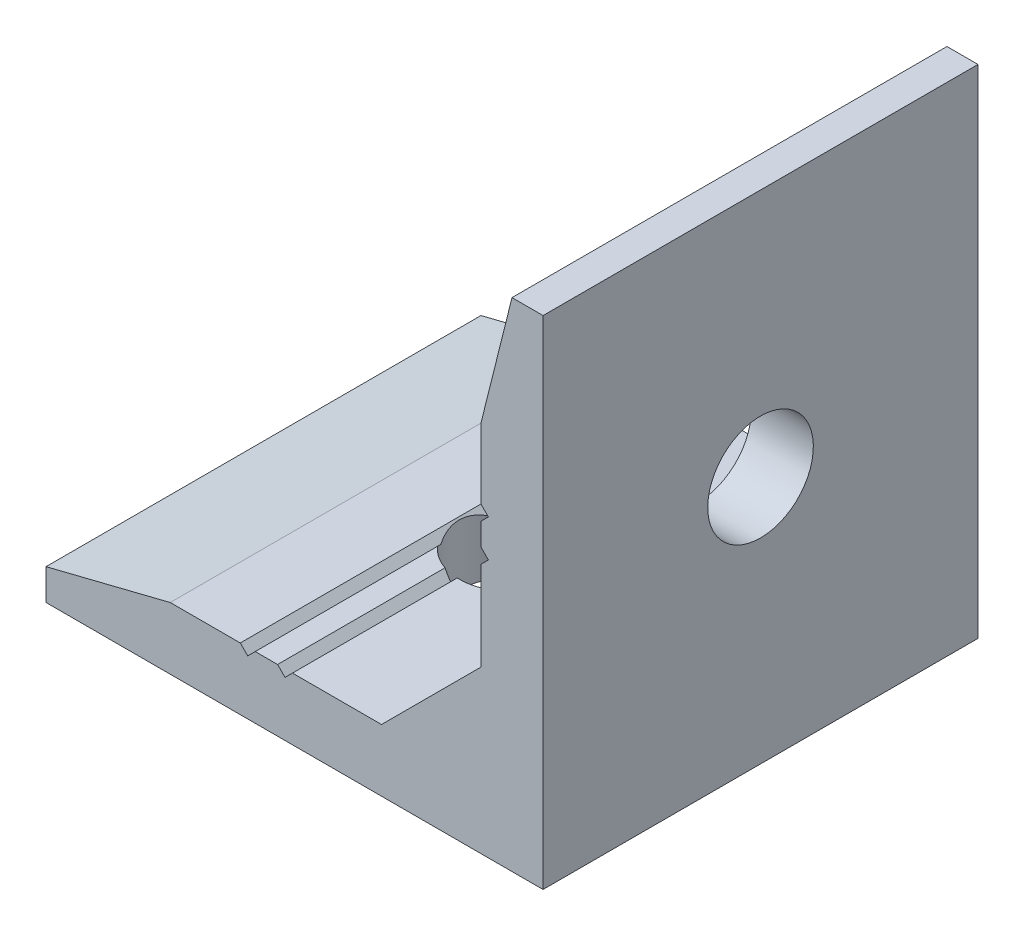
ISO-10303-21;
HEADER;
FILE_DESCRIPTION(('STEP AP214'),'2;1');
FILE_NAME('part.step','',(''),(''),'','','');
FILE_SCHEMA(('AUTOMOTIVE_DESIGN { 1 0 10303 214 1 1 1 1 }'));
ENDSEC;
DATA;
#1=APPLICATION_CONTEXT('core data for automotive mechanical design processes');
#2=APPLICATION_PROTOCOL_DEFINITION('international standard','automotive_design',2000,#1);
#3=PRODUCT_CONTEXT('',#1,'mechanical');
#4=PRODUCT('Part','Part','',(#3));
#5=PRODUCT_RELATED_PRODUCT_CATEGORY('part','',(#4));
#6=PRODUCT_DEFINITION_FORMATION('','',#4);
#7=PRODUCT_DEFINITION_CONTEXT('part definition',#1,'design');
#8=PRODUCT_DEFINITION('design','',#6,#7);
#9=PRODUCT_DEFINITION_SHAPE('','',#8);
#10=(LENGTH_UNIT() NAMED_UNIT(*) SI_UNIT(.MILLI.,.METRE.));
#11=(NAMED_UNIT(*) PLANE_ANGLE_UNIT() SI_UNIT($,.RADIAN.));
#12=(NAMED_UNIT(*) SI_UNIT($,.STERADIAN.) SOLID_ANGLE_UNIT());
#13=UNCERTAINTY_MEASURE_WITH_UNIT(LENGTH_MEASURE(1.E-05),#10,'distance_accuracy_value','');
#14=(GEOMETRIC_REPRESENTATION_CONTEXT(3) GLOBAL_UNCERTAINTY_ASSIGNED_CONTEXT((#13)) GLOBAL_UNIT_ASSIGNED_CONTEXT((#10,
#11,#12)) REPRESENTATION_CONTEXT('',''));
#15=CARTESIAN_POINT('',(0.,0.,0.));
#16=DIRECTION('',(0.,0.,1.));
#17=DIRECTION('',(1.,0.,0.));
#18=AXIS2_PLACEMENT_3D('',#15,#16,#17);
#19=CARTESIAN_POINT('',(35.599999999999,23.7649508334723,17.5));
#20=DIRECTION('',(0.707106781186548,-0.707106781186548,0.));
#21=DIRECTION('',(0.707106781186548,0.707106781186548,0.));
#22=AXIS2_PLACEMENT_3D('',#19,#20,#21);
#23=PLANE('',#22);
#24=DIRECTION('',(0.,0.,-1.));
#25=VECTOR('',#24,1.);
#26=CARTESIAN_POINT('',(35.,23.1649508334733,17.5));
#27=LINE('',#26,#25);
#28=CARTESIAN_POINT('',(35.0000000000001,23.1649508334733,-2.83647425895197));
#29=VERTEX_POINT('',#28);
#30=CARTESIAN_POINT('',(35.,23.1649508334733,-17.5));
#31=VERTEX_POINT('',#30);
#32=EDGE_CURVE('E268',#29,#31,#27,.T.);
#33=ORIENTED_EDGE('',*,*,#32,.F.);
#34=CARTESIAN_POINT('',(31.8350491665269,20.0000000000002,0.));
#35=DIRECTION('',(0.707106781186548,-0.707106781186548,0.));
#36=DIRECTION('',(-0.707106781186548,-0.707106781186548,0.));
#37=AXIS2_PLACEMENT_3D('',#34,#35,#36);
#38=ELLIPSE('',#37,6.01040764008546,4.25);
#39=CARTESIAN_POINT('',(35.599999999999,23.7649508334723,-1.97171124192581));
#40=VERTEX_POINT('',#39);
#41=EDGE_CURVE('E546',#29,#40,#38,.T.);
#42=ORIENTED_EDGE('',*,*,#41,.T.);
#43=DIRECTION('',(0.,0.,-1.));
#44=VECTOR('',#43,1.);
#45=CARTESIAN_POINT('',(35.599999999999,23.7649508334723,17.5));
#46=LINE('',#45,#44);
#47=CARTESIAN_POINT('',(35.599999999999,23.7649508334723,-17.5));
#48=VERTEX_POINT('',#47);
#49=EDGE_CURVE('E272',#40,#48,#46,.T.);
#50=ORIENTED_EDGE('',*,*,#49,.T.);
#51=DIRECTION('',(-0.707106781186548,-0.707106781186548,0.));
#52=VECTOR('',#51,1.);
#53=CARTESIAN_POINT('',(35.599999999999,23.7649508334723,-17.5));
#54=LINE('',#53,#52);
#55=EDGE_CURVE('E416',#48,#31,#54,.T.);
#56=ORIENTED_EDGE('',*,*,#55,.T.);
#57=EDGE_LOOP('',(#33,#42,#50,#56));
#58=FACE_BOUND('',#57,.T.);
#59=ADVANCED_FACE('F35',(#58),#23,.F.);
#60=CARTESIAN_POINT('',(34.9999999999998,21.3649508334714,17.5));
#61=DIRECTION('',(1.,-1.27213054904832E-13,0.));
#62=DIRECTION('',(1.27213054904832E-13,1.,0.));
#63=AXIS2_PLACEMENT_3D('',#60,#61,#62);
#64=PLANE('',#63);
#65=CARTESIAN_POINT('',(35.,23.1649508334733,17.5));
#66=VERTEX_POINT('',#65);
#67=CARTESIAN_POINT('',(35.0000000000001,23.1649508334733,2.83647425895197));
#68=VERTEX_POINT('',#67);
#69=EDGE_CURVE('E269',#66,#68,#27,.T.);
#70=ORIENTED_EDGE('',*,*,#69,.T.);
#71=CARTESIAN_POINT('',(35.,20.0000000000001,0.));
#72=DIRECTION('',(-1.,0.,0.));
#73=DIRECTION('',(0.,-1.,0.));
#74=AXIS2_PLACEMENT_3D('',#71,#72,#73);
#75=CIRCLE('',#74,4.25);
#76=CARTESIAN_POINT('',(35.0000000000001,21.3649508334712,4.0248489688691));
#77=VERTEX_POINT('',#76);
#78=EDGE_CURVE('E629',#77,#68,#75,.T.);
#79=ORIENTED_EDGE('',*,*,#78,.F.);
#80=DIRECTION('',(0.,0.,-1.));
#81=VECTOR('',#80,1.);
#82=CARTESIAN_POINT('',(34.9999999999998,21.3649508334714,17.5));
#83=LINE('',#82,#81);
#84=CARTESIAN_POINT('',(34.9999999999998,21.3649508334714,17.5));
#85=VERTEX_POINT('',#84);
#86=EDGE_CURVE('E265',#85,#77,#83,.T.);
#87=ORIENTED_EDGE('',*,*,#86,.F.);
#88=DIRECTION('',(-1.27213054904832E-13,-1.,0.));
#89=VECTOR('',#88,1.);
#90=CARTESIAN_POINT('',(34.9999999999998,21.3649508334714,17.5));
#91=LINE('',#90,#89);
#92=EDGE_CURVE('E492',#66,#85,#91,.T.);
#93=ORIENTED_EDGE('',*,*,#92,.F.);
#94=EDGE_LOOP('',(#70,#79,#87,#93));
#95=FACE_BOUND('',#94,.T.);
#96=ADVANCED_FACE('F525',(#95),#64,.F.);
#97=CARTESIAN_POINT('',(35.5999999999993,20.7649508334723,17.5));
#98=DIRECTION('',(0.707106781186345,0.70710678118675,0.));
#99=DIRECTION('',(-0.70710678118675,0.707106781186345,0.));
#100=AXIS2_PLACEMENT_3D('',#97,#98,#99);
#101=PLANE('',#100);
#102=ORIENTED_EDGE('',*,*,#86,.T.);
#103=CARTESIAN_POINT('',(36.364950833472,20.,0.));
#104=DIRECTION('',(0.707106781186345,0.70710678118675,0.));
#105=DIRECTION('',(-0.70710678118675,0.707106781186345,0.));
#106=AXIS2_PLACEMENT_3D('',#103,#104,#105);
#107=ELLIPSE('',#106,6.01040764008757,4.25);
#108=CARTESIAN_POINT('',(35.5999999999993,20.7649508334723,4.18059208992819));
#109=VERTEX_POINT('',#108);
#110=EDGE_CURVE('E250',#77,#109,#107,.T.);
#111=ORIENTED_EDGE('',*,*,#110,.T.);
#112=DIRECTION('',(0.,0.,-1.));
#113=VECTOR('',#112,1.);
#114=CARTESIAN_POINT('',(35.5999999999993,20.7649508334723,17.5));
#115=LINE('',#114,#113);
#116=CARTESIAN_POINT('',(35.5999999999993,20.7649508334723,17.5));
#117=VERTEX_POINT('',#116);
#118=EDGE_CURVE('E249',#117,#109,#115,.T.);
#119=ORIENTED_EDGE('',*,*,#118,.F.);
#120=DIRECTION('',(0.70710678118675,-0.707106781186345,0.));
#121=VECTOR('',#120,1.);
#122=CARTESIAN_POINT('',(35.5999999999993,20.7649508334723,17.5));
#123=LINE('',#122,#121);
#124=EDGE_CURVE('E494',#85,#117,#123,.T.);
#125=ORIENTED_EDGE('',*,*,#124,.F.);
#126=EDGE_LOOP('',(#102,#111,#119,#125));
#127=FACE_BOUND('',#126,.T.);
#128=ADVANCED_FACE('F531',(#127),#101,.F.);
#129=CARTESIAN_POINT('',(35.5999999999993,20.7649508334723,17.5));
#130=DIRECTION('',(0.707106781186615,-0.70710678118648,0.));
#131=DIRECTION('',(0.70710678118648,0.707106781186615,0.));
#132=AXIS2_PLACEMENT_3D('',#129,#130,#131);
#133=PLANE('',#132);
#134=DIRECTION('',(0.,0.,-1.));
#135=VECTOR('',#134,1.);
#136=CARTESIAN_POINT('',(35.,20.164950833473,17.5));
#137=LINE('',#136,#135);
#138=CARTESIAN_POINT('',(35.,20.164950833473,-4.24679776096491));
#139=VERTEX_POINT('',#138);
#140=CARTESIAN_POINT('',(35.,20.164950833473,-17.5));
#141=VERTEX_POINT('',#140);
#142=EDGE_CURVE('E257',#139,#141,#137,.T.);
#143=ORIENTED_EDGE('',*,*,#142,.F.);
#144=CARTESIAN_POINT('',(34.8350491665272,20.0000000000001,0.));
#145=DIRECTION('',(0.707106781186615,-0.70710678118648,0.));
#146=DIRECTION('',(-0.70710678118648,-0.707106781186615,0.));
#147=AXIS2_PLACEMENT_3D('',#144,#145,#146);
#148=ELLIPSE('',#147,6.01040764008489,4.25);
#149=CARTESIAN_POINT('',(35.5999999999993,20.7649508334723,-4.18059208992818));
#150=VERTEX_POINT('',#149);
#151=EDGE_CURVE('E50',#139,#150,#148,.T.);
#152=ORIENTED_EDGE('',*,*,#151,.T.);
#153=CARTESIAN_POINT('',(35.5999999999993,20.7649508334723,-17.5));
#154=VERTEX_POINT('',#153);
#155=EDGE_CURVE('E256',#150,#154,#115,.T.);
#156=ORIENTED_EDGE('',*,*,#155,.T.);
#157=DIRECTION('',(-0.70710678118648,-0.707106781186615,0.));
#158=VECTOR('',#157,1.);
#159=CARTESIAN_POINT('',(35.5999999999993,20.7649508334723,-17.5));
#160=LINE('',#159,#158);
#161=EDGE_CURVE('E356',#154,#141,#160,.T.);
#162=ORIENTED_EDGE('',*,*,#161,.T.);
#163=EDGE_LOOP('',(#143,#152,#156,#162));
#164=FACE_BOUND('',#163,.T.);
#165=ADVANCED_FACE('F426',(#164),#133,.F.);
#166=CARTESIAN_POINT('',(19.2350491665275,4.39999999999998,17.5));
#167=DIRECTION('',(0.707106781186479,-0.707106781186616,0.));
#168=DIRECTION('',(0.707106781186616,0.707106781186479,0.));
#169=AXIS2_PLACEMENT_3D('',#166,#167,#168);
#170=PLANE('',#169);
#171=DIRECTION('',(0.,0.,-1.));
#172=VECTOR('',#171,1.);
#173=CARTESIAN_POINT('',(19.8350491665276,5.,17.5));
#174=LINE('',#173,#172);
#175=CARTESIAN_POINT('',(19.8350491665276,5.,17.5));
#176=VERTEX_POINT('',#175);
#177=CARTESIAN_POINT('',(19.8350491665276,5.,4.24679776096493));
#178=VERTEX_POINT('',#177);
#179=EDGE_CURVE('E329',#176,#178,#174,.T.);
#180=ORIENTED_EDGE('',*,*,#179,.T.);
#181=CARTESIAN_POINT('',(20.,5.16495083347237,0.));
#182=DIRECTION('',(0.707106781186479,-0.707106781186616,0.));
#183=DIRECTION('',(0.707106781186616,0.707106781186479,0.));
#184=AXIS2_PLACEMENT_3D('',#181,#182,#183);
#185=ELLIPSE('',#184,6.01040764008507,4.25);
#186=CARTESIAN_POINT('',(19.2350491665275,4.39999999999998,4.18059208992814));
#187=VERTEX_POINT('',#186);
#188=EDGE_CURVE('E402',#178,#187,#185,.T.);
#189=ORIENTED_EDGE('',*,*,#188,.T.);
#190=DIRECTION('',(0.,0.,-1.));
#191=VECTOR('',#190,1.);
#192=CARTESIAN_POINT('',(19.2350491665275,4.39999999999998,17.5));
#193=LINE('',#192,#191);
#194=CARTESIAN_POINT('',(19.2350491665275,4.39999999999998,17.5));
#195=VERTEX_POINT('',#194);
#196=EDGE_CURVE('E325',#195,#187,#193,.T.);
#197=ORIENTED_EDGE('',*,*,#196,.F.);
#198=DIRECTION('',(-0.707106781186616,-0.707106781186479,0.));
#199=VECTOR('',#198,1.);
#200=CARTESIAN_POINT('',(19.2350491665275,4.39999999999998,17.5));
#201=LINE('',#200,#199);
#202=EDGE_CURVE('E502',#176,#195,#201,.T.);
#203=ORIENTED_EDGE('',*,*,#202,.F.);
#204=EDGE_LOOP('',(#180,#189,#197,#203));
#205=FACE_BOUND('',#204,.T.);
#206=ADVANCED_FACE('F599',(#205),#170,.F.);
#207=CARTESIAN_POINT('',(19.2350491665275,4.39999999999998,17.5));
#208=DIRECTION('',(-0.707106781186481,-0.707106781186614,0.));
#209=DIRECTION('',(0.707106781186614,-0.707106781186481,0.));
#210=AXIS2_PLACEMENT_3D('',#207,#208,#209);
#211=PLANE('',#210);
#212=DIRECTION('',(0.,0.,-1.));
#213=VECTOR('',#212,1.);
#214=CARTESIAN_POINT('',(18.6350491665274,5.,17.5));
#215=LINE('',#214,#213);
#216=CARTESIAN_POINT('',(18.6350491665274,5.,-4.02484896886855));
#217=VERTEX_POINT('',#216);
#218=CARTESIAN_POINT('',(18.6350491665274,5.,-17.5));
#219=VERTEX_POINT('',#218);
#220=EDGE_CURVE('E320',#217,#219,#215,.T.);
#221=ORIENTED_EDGE('',*,*,#220,.F.);
#222=CARTESIAN_POINT('',(20.,3.63504916652758,0.));
#223=DIRECTION('',(-0.707106781186481,-0.707106781186614,0.));
#224=DIRECTION('',(-0.707106781186614,0.707106781186481,0.));
#225=AXIS2_PLACEMENT_3D('',#222,#223,#224);
#226=ELLIPSE('',#225,6.01040764008509,4.25);
#227=CARTESIAN_POINT('',(19.2350491665275,4.39999999999998,-4.18059208992814));
#228=VERTEX_POINT('',#227);
#229=EDGE_CURVE('E400',#217,#228,#226,.T.);
#230=ORIENTED_EDGE('',*,*,#229,.T.);
#231=CARTESIAN_POINT('',(19.2350491665275,4.39999999999998,-17.5));
#232=VERTEX_POINT('',#231);
#233=EDGE_CURVE('E324',#228,#232,#193,.T.);
#234=ORIENTED_EDGE('',*,*,#233,.T.);
#235=DIRECTION('',(-0.707106781186614,0.707106781186481,0.));
#236=VECTOR('',#235,1.);
#237=CARTESIAN_POINT('',(19.2350491665275,4.39999999999998,-17.5));
#238=LINE('',#237,#236);
#239=EDGE_CURVE('E362',#232,#219,#238,.T.);
#240=ORIENTED_EDGE('',*,*,#239,.T.);
#241=EDGE_LOOP('',(#221,#230,#234,#240));
#242=FACE_BOUND('',#241,.T.);
#243=ADVANCED_FACE('F568',(#242),#211,.F.);
#244=CARTESIAN_POINT('',(16.8350491665274,5.,17.5));
#245=DIRECTION('',(0.,-1.,0.));
#246=DIRECTION('',(0.,0.,-1.));
#247=AXIS2_PLACEMENT_3D('',#244,#245,#246);
#248=PLANE('',#247);
#249=CARTESIAN_POINT('',(18.6350491665274,5.,17.5));
#250=VERTEX_POINT('',#249);
#251=CARTESIAN_POINT('',(18.6350491665274,5.,4.02484896886855));
#252=VERTEX_POINT('',#251);
#253=EDGE_CURVE('E321',#250,#252,#215,.T.);
#254=ORIENTED_EDGE('',*,*,#253,.T.);
#255=CARTESIAN_POINT('',(20.,5.,0.));
#256=DIRECTION('',(0.,1.,0.));
#257=DIRECTION('',(0.,0.,1.));
#258=AXIS2_PLACEMENT_3D('',#255,#256,#257);
#259=CIRCLE('',#258,4.25);
#260=CARTESIAN_POINT('',(16.8350491665274,5.,2.83647425895264));
#261=VERTEX_POINT('',#260);
#262=EDGE_CURVE('E557',#261,#252,#259,.T.);
#263=ORIENTED_EDGE('',*,*,#262,.F.);
#264=DIRECTION('',(0.,0.,-1.));
#265=VECTOR('',#264,1.);
#266=CARTESIAN_POINT('',(16.8350491665274,5.,17.5));
#267=LINE('',#266,#265);
#268=CARTESIAN_POINT('',(16.8350491665274,5.,17.5));
#269=VERTEX_POINT('',#268);
#270=EDGE_CURVE('E317',#269,#261,#267,.T.);
#271=ORIENTED_EDGE('',*,*,#270,.F.);
#272=DIRECTION('',(-1.,0.,0.));
#273=VECTOR('',#272,1.);
#274=CARTESIAN_POINT('',(16.8350491665274,5.,17.5));
#275=LINE('',#274,#273);
#276=EDGE_CURVE('E506',#250,#269,#275,.T.);
#277=ORIENTED_EDGE('',*,*,#276,.F.);
#278=EDGE_LOOP('',(#254,#263,#271,#277));
#279=FACE_BOUND('',#278,.T.);
#280=ADVANCED_FACE('F580',(#279),#248,.F.);
#281=CARTESIAN_POINT('',(16.2350491665275,4.39999999999998,17.5));
#282=DIRECTION('',(0.707106781186614,-0.707106781186481,0.));
#283=DIRECTION('',(0.707106781186481,0.707106781186614,0.));
#284=AXIS2_PLACEMENT_3D('',#281,#282,#283);
#285=PLANE('',#284);
#286=ORIENTED_EDGE('',*,*,#270,.T.);
#287=CARTESIAN_POINT('',(20.,8.16495083347323,0.));
#288=DIRECTION('',(0.707106781186614,-0.707106781186481,0.));
#289=DIRECTION('',(0.707106781186481,0.707106781186614,0.));
#290=AXIS2_PLACEMENT_3D('',#287,#288,#289);
#291=ELLIPSE('',#290,6.01040764008622,4.25);
#292=CARTESIAN_POINT('',(16.2350491665275,4.39999999999998,1.97171124192526));
#293=VERTEX_POINT('',#292);
#294=EDGE_CURVE('E558',#261,#293,#291,.T.);
#295=ORIENTED_EDGE('',*,*,#294,.T.);
#296=DIRECTION('',(0.,0.,-1.));
#297=VECTOR('',#296,1.);
#298=CARTESIAN_POINT('',(16.2350491665275,4.39999999999998,17.5));
#299=LINE('',#298,#297);
#300=CARTESIAN_POINT('',(16.2350491665275,4.39999999999998,17.5));
#301=VERTEX_POINT('',#300);
#302=EDGE_CURVE('E301',#301,#293,#299,.T.);
#303=ORIENTED_EDGE('',*,*,#302,.F.);
#304=DIRECTION('',(-0.707106781186481,-0.707106781186614,0.));
#305=VECTOR('',#304,1.);
#306=CARTESIAN_POINT('',(16.2350491665275,4.39999999999998,17.5));
#307=LINE('',#306,#305);
#308=EDGE_CURVE('E508',#269,#301,#307,.T.);
#309=ORIENTED_EDGE('',*,*,#308,.F.);
#310=EDGE_LOOP('',(#286,#295,#303,#309));
#311=FACE_BOUND('',#310,.T.);
#312=ADVANCED_FACE('F584',(#311),#285,.F.);
#313=CARTESIAN_POINT('',(0.,2.5,17.5));
#314=DIRECTION('',(1.,0.,0.));
#315=DIRECTION('',(0.,0.,-1.));
#316=AXIS2_PLACEMENT_3D('',#313,#314,#315);
#317=PLANE('',#316);
#318=DIRECTION('',(0.,-1.,0.));
#319=VECTOR('',#318,1.);
#320=CARTESIAN_POINT('',(0.,2.5,-17.5));
#321=LINE('',#320,#319);
#322=CARTESIAN_POINT('',(0.,2.5,-17.5));
#323=VERTEX_POINT('',#322);
#324=CARTESIAN_POINT('',(0.,0.,-17.5));
#325=VERTEX_POINT('',#324);
#326=EDGE_CURVE('E390',#323,#325,#321,.T.);
#327=ORIENTED_EDGE('',*,*,#326,.T.);
#328=DIRECTION('',(0.,0.,-1.));
#329=VECTOR('',#328,1.);
#330=CARTESIAN_POINT('',(0.,0.,17.5));
#331=LINE('',#330,#329);
#332=CARTESIAN_POINT('',(0.,0.,17.5));
#333=VERTEX_POINT('',#332);
#334=EDGE_CURVE('E291',#333,#325,#331,.T.);
#335=ORIENTED_EDGE('',*,*,#334,.F.);
#336=DIRECTION('',(0.,-1.,0.));
#337=VECTOR('',#336,1.);
#338=CARTESIAN_POINT('',(0.,2.5,17.5));
#339=LINE('',#338,#337);
#340=CARTESIAN_POINT('',(0.,2.5,17.5));
#341=VERTEX_POINT('',#340);
#342=EDGE_CURVE('E375',#341,#333,#339,.T.);
#343=ORIENTED_EDGE('',*,*,#342,.F.);
#344=DIRECTION('',(0.,0.,-1.));
#345=VECTOR('',#344,1.);
#346=CARTESIAN_POINT('',(0.,2.5,17.5));
#347=LINE('',#346,#345);
#348=EDGE_CURVE('E376',#341,#323,#347,.T.);
#349=ORIENTED_EDGE('',*,*,#348,.T.);
#350=EDGE_LOOP('',(#327,#335,#343,#349));
#351=FACE_BOUND('',#350,.T.);
#352=ADVANCED_FACE('F37',(#351),#317,.F.);
#353=CARTESIAN_POINT('',(0.,0.,17.5));
#354=DIRECTION('',(0.,1.,0.));
#355=DIRECTION('',(0.,0.,1.));
#356=AXIS2_PLACEMENT_3D('',#353,#354,#355);
#357=PLANE('',#356);
#358=CARTESIAN_POINT('',(20.,0.,0.));
#359=DIRECTION('',(0.,1.,0.));
#360=DIRECTION('',(0.,0.,1.));
#361=AXIS2_PLACEMENT_3D('',#358,#359,#360);
#362=CIRCLE('',#361,4.25);
#363=CARTESIAN_POINT('',(20.,0.,4.25));
#364=VERTEX_POINT('',#363);
#365=EDGE_CURVE('E552',#364,#364,#362,.T.);
#366=ORIENTED_EDGE('',*,*,#365,.T.);
#367=EDGE_LOOP('',(#366));
#368=FACE_BOUND('',#367,.T.);
#369=DIRECTION('',(1.,0.,0.));
#370=VECTOR('',#369,1.);
#371=CARTESIAN_POINT('',(0.,0.,-17.5));
#372=LINE('',#371,#370);
#373=CARTESIAN_POINT('',(40.,0.,-17.5));
#374=VERTEX_POINT('',#373);
#375=EDGE_CURVE('E392',#325,#374,#372,.T.);
#376=ORIENTED_EDGE('',*,*,#375,.T.);
#377=DIRECTION('',(0.,0.,-1.));
#378=VECTOR('',#377,1.);
#379=CARTESIAN_POINT('',(40.,0.,17.5));
#380=LINE('',#379,#378);
#381=CARTESIAN_POINT('',(40.,0.,17.5));
#382=VERTEX_POINT('',#381);
#383=EDGE_CURVE('E288',#382,#374,#380,.T.);
#384=ORIENTED_EDGE('',*,*,#383,.F.);
#385=DIRECTION('',(1.,0.,0.));
#386=VECTOR('',#385,1.);
#387=CARTESIAN_POINT('',(0.,0.,17.5));
#388=LINE('',#387,#386);
#389=EDGE_CURVE('E477',#333,#382,#388,.T.);
#390=ORIENTED_EDGE('',*,*,#389,.F.);
#391=ORIENTED_EDGE('',*,*,#334,.T.);
#392=EDGE_LOOP('',(#376,#384,#390,#391));
#393=FACE_BOUND('',#392,.T.);
#394=ADVANCED_FACE('F476',(#368,#393),#357,.F.);
#395=CARTESIAN_POINT('',(40.,0.,17.5));
#396=DIRECTION('',(-1.,0.,0.));
#397=DIRECTION('',(0.,0.,1.));
#398=AXIS2_PLACEMENT_3D('',#395,#396,#397);
#399=PLANE('',#398);
#400=CARTESIAN_POINT('',(40.0000000000007,19.9999999999999,0.));
#401=DIRECTION('',(-1.,0.,0.));
#402=DIRECTION('',(0.,-1.,0.));
#403=AXIS2_PLACEMENT_3D('',#400,#401,#402);
#404=CIRCLE('',#403,4.25);
#405=CARTESIAN_POINT('',(40.0000000000005,15.7499999999999,0.));
#406=VERTEX_POINT('',#405);
#407=EDGE_CURVE('E251',#406,#406,#404,.T.);
#408=ORIENTED_EDGE('',*,*,#407,.T.);
#409=EDGE_LOOP('',(#408));
#410=FACE_BOUND('',#409,.T.);
#411=DIRECTION('',(0.,1.,0.));
#412=VECTOR('',#411,1.);
#413=CARTESIAN_POINT('',(40.,0.,-17.5));
#414=LINE('',#413,#412);
#415=CARTESIAN_POINT('',(40.,40.,-17.5));
#416=VERTEX_POINT('',#415);
#417=EDGE_CURVE('E397',#374,#416,#414,.T.);
#418=ORIENTED_EDGE('',*,*,#417,.T.);
#419=DIRECTION('',(0.,0.,-1.));
#420=VECTOR('',#419,1.);
#421=CARTESIAN_POINT('',(40.,40.,17.5));
#422=LINE('',#421,#420);
#423=CARTESIAN_POINT('',(40.,40.,17.5));
#424=VERTEX_POINT('',#423);
#425=EDGE_CURVE('E285',#424,#416,#422,.T.);
#426=ORIENTED_EDGE('',*,*,#425,.F.);
#427=DIRECTION('',(0.,1.,0.));
#428=VECTOR('',#427,1.);
#429=CARTESIAN_POINT('',(40.,0.,17.5));
#430=LINE('',#429,#428);
#431=EDGE_CURVE('E473',#382,#424,#430,.T.);
#432=ORIENTED_EDGE('',*,*,#431,.F.);
#433=ORIENTED_EDGE('',*,*,#383,.T.);
#434=EDGE_LOOP('',(#418,#426,#432,#433));
#435=FACE_BOUND('',#434,.T.);
#436=ADVANCED_FACE('F472',(#410,#435),#399,.F.);
#437=CARTESIAN_POINT('',(37.5,40.,17.5));
#438=DIRECTION('',(0.,-1.,0.));
#439=DIRECTION('',(0.,0.,-1.));
#440=AXIS2_PLACEMENT_3D('',#437,#438,#439);
#441=PLANE('',#440);
#442=DIRECTION('',(-1.,0.,0.));
#443=VECTOR('',#442,1.);
#444=CARTESIAN_POINT('',(37.5,40.,-17.5));
#445=LINE('',#444,#443);
#446=CARTESIAN_POINT('',(37.5,40.,-17.5));
#447=VERTEX_POINT('',#446);
#448=EDGE_CURVE('E407',#416,#447,#445,.T.);
#449=ORIENTED_EDGE('',*,*,#448,.T.);
#450=DIRECTION('',(0.,0.,-1.));
#451=VECTOR('',#450,1.);
#452=CARTESIAN_POINT('',(37.5,40.,17.5));
#453=LINE('',#452,#451);
#454=CARTESIAN_POINT('',(37.5,40.,17.5));
#455=VERTEX_POINT('',#454);
#456=EDGE_CURVE('E282',#455,#447,#453,.T.);
#457=ORIENTED_EDGE('',*,*,#456,.F.);
#458=DIRECTION('',(-1.,0.,0.));
#459=VECTOR('',#458,1.);
#460=CARTESIAN_POINT('',(37.5,40.,17.5));
#461=LINE('',#460,#459);
#462=EDGE_CURVE('E469',#424,#455,#461,.T.);
#463=ORIENTED_EDGE('',*,*,#462,.F.);
#464=ORIENTED_EDGE('',*,*,#425,.T.);
#465=EDGE_LOOP('',(#449,#457,#463,#464));
#466=FACE_BOUND('',#465,.T.);
#467=ADVANCED_FACE('F466',(#466),#441,.F.);
#468=CARTESIAN_POINT('',(37.5,40.,17.5));
#469=DIRECTION('',(0.970142500145332,-0.242535625036332,0.));
#470=DIRECTION('',(0.242535625036332,0.970142500145332,0.));
#471=AXIS2_PLACEMENT_3D('',#468,#469,#470);
#472=PLANE('',#471);
#473=DIRECTION('',(-0.242535625036332,-0.970142500145332,0.));
#474=VECTOR('',#473,1.);
#475=CARTESIAN_POINT('',(37.5,40.,-17.5));
#476=LINE('',#475,#474);
#477=CARTESIAN_POINT('',(35.,30.,-17.5));
#478=VERTEX_POINT('',#477);
#479=EDGE_CURVE('E409',#447,#478,#476,.T.);
#480=ORIENTED_EDGE('',*,*,#479,.T.);
#481=DIRECTION('',(0.,0.,-1.));
#482=VECTOR('',#481,1.);
#483=CARTESIAN_POINT('',(35.,30.,17.5));
#484=LINE('',#483,#482);
#485=CARTESIAN_POINT('',(35.,30.,17.5));
#486=VERTEX_POINT('',#485);
#487=EDGE_CURVE('E279',#486,#478,#484,.T.);
#488=ORIENTED_EDGE('',*,*,#487,.F.);
#489=DIRECTION('',(-0.242535625036332,-0.970142500145332,0.));
#490=VECTOR('',#489,1.);
#491=CARTESIAN_POINT('',(37.5,40.,17.5));
#492=LINE('',#491,#490);
#493=EDGE_CURVE('E462',#455,#486,#492,.T.);
#494=ORIENTED_EDGE('',*,*,#493,.F.);
#495=ORIENTED_EDGE('',*,*,#456,.T.);
#496=EDGE_LOOP('',(#480,#488,#494,#495));
#497=FACE_BOUND('',#496,.T.);
#498=ADVANCED_FACE('F461',(#497),#472,.F.);
#499=CARTESIAN_POINT('',(35.,24.3649508334714,17.5));
#500=DIRECTION('',(1.,0.,0.));
#501=DIRECTION('',(0.,0.,-1.));
#502=AXIS2_PLACEMENT_3D('',#499,#500,#501);
#503=PLANE('',#502);
#504=DIRECTION('',(0.,-1.,0.));
#505=VECTOR('',#504,1.);
#506=CARTESIAN_POINT('',(35.,24.3649508334714,-17.5));
#507=LINE('',#506,#505);
#508=CARTESIAN_POINT('',(35.,24.3649508334714,-17.5));
#509=VERTEX_POINT('',#508);
#510=EDGE_CURVE('E411',#478,#509,#507,.T.);
#511=ORIENTED_EDGE('',*,*,#510,.T.);
#512=DIRECTION('',(0.,0.,-1.));
#513=VECTOR('',#512,1.);
#514=CARTESIAN_POINT('',(35.,24.3649508334714,17.5));
#515=LINE('',#514,#513);
#516=CARTESIAN_POINT('',(35.,24.3649508334714,17.5));
#517=VERTEX_POINT('',#516);
#518=EDGE_CURVE('E276',#517,#509,#515,.T.);
#519=ORIENTED_EDGE('',*,*,#518,.F.);
#520=DIRECTION('',(0.,-1.,0.));
#521=VECTOR('',#520,1.);
#522=CARTESIAN_POINT('',(35.,24.3649508334714,17.5));
#523=LINE('',#522,#521);
#524=EDGE_CURVE('E457',#486,#517,#523,.T.);
#525=ORIENTED_EDGE('',*,*,#524,.F.);
#526=ORIENTED_EDGE('',*,*,#487,.T.);
#527=EDGE_LOOP('',(#511,#519,#525,#526));
#528=FACE_BOUND('',#527,.T.);
#529=ADVANCED_FACE('F456',(#528),#503,.F.);
#530=CARTESIAN_POINT('',(35.599999999999,23.7649508334723,17.5));
#531=DIRECTION('',(0.707106781186617,0.707106781186478,0.));
#532=DIRECTION('',(-0.707106781186478,0.707106781186617,0.));
#533=AXIS2_PLACEMENT_3D('',#530,#531,#532);
#534=PLANE('',#533);
#535=ORIENTED_EDGE('',*,*,#49,.F.);
#536=CARTESIAN_POINT('',(39.3649508334707,19.9999999999999,0.));
#537=DIRECTION('',(0.707106781186617,0.707106781186478,0.));
#538=DIRECTION('',(-0.707106781186478,0.707106781186617,0.));
#539=AXIS2_PLACEMENT_3D('',#536,#537,#538);
#540=ELLIPSE('',#539,6.01040764008526,4.25);
#541=CARTESIAN_POINT('',(35.599999999999,23.7649508334723,1.97171124192582));
#542=VERTEX_POINT('',#541);
#543=EDGE_CURVE('E545',#40,#542,#540,.T.);
#544=ORIENTED_EDGE('',*,*,#543,.T.);
#545=CARTESIAN_POINT('',(35.599999999999,23.7649508334723,17.5));
#546=VERTEX_POINT('',#545);
#547=EDGE_CURVE('E273',#546,#542,#46,.T.);
#548=ORIENTED_EDGE('',*,*,#547,.F.);
#549=DIRECTION('',(0.707106781186478,-0.707106781186617,0.));
#550=VECTOR('',#549,1.);
#551=CARTESIAN_POINT('',(35.599999999999,23.7649508334723,17.5));
#552=LINE('',#551,#550);
#553=EDGE_CURVE('E453',#517,#546,#552,.T.);
#554=ORIENTED_EDGE('',*,*,#553,.F.);
#555=ORIENTED_EDGE('',*,*,#518,.T.);
#556=DIRECTION('',(0.707106781186478,-0.707106781186617,0.));
#557=VECTOR('',#556,1.);
#558=CARTESIAN_POINT('',(35.599999999999,23.7649508334723,-17.5));
#559=LINE('',#558,#557);
#560=EDGE_CURVE('E413',#509,#48,#559,.T.);
#561=ORIENTED_EDGE('',*,*,#560,.T.);
#562=EDGE_LOOP('',(#535,#544,#548,#554,#555,#561));
#563=FACE_BOUND('',#562,.T.);
#564=ADVANCED_FACE('F448',(#563),#534,.F.);
#565=ORIENTED_EDGE('',*,*,#547,.T.);
#566=EDGE_CURVE('E544',#542,#68,#38,.T.);
#567=ORIENTED_EDGE('',*,*,#566,.T.);
#568=ORIENTED_EDGE('',*,*,#69,.F.);
#569=DIRECTION('',(-0.707106781186548,-0.707106781186548,0.));
#570=VECTOR('',#569,1.);
#571=CARTESIAN_POINT('',(35.599999999999,23.7649508334723,17.5));
#572=LINE('',#571,#570);
#573=EDGE_CURVE('E490',#546,#66,#572,.T.);
#574=ORIENTED_EDGE('',*,*,#573,.F.);
#575=EDGE_LOOP('',(#565,#567,#568,#574));
#576=FACE_BOUND('',#575,.T.);
#577=ADVANCED_FACE('F527',(#576),#23,.F.);
#578=CARTESIAN_POINT('',(35.0000000000001,21.3649508334712,-4.0248489688691));
#579=VERTEX_POINT('',#578);
#580=CARTESIAN_POINT('',(34.9999999999998,21.3649508334714,-17.5));
#581=VERTEX_POINT('',#580);
#582=EDGE_CURVE('E264',#579,#581,#83,.T.);
#583=ORIENTED_EDGE('',*,*,#582,.F.);
#584=EDGE_CURVE('E440',#29,#579,#75,.T.);
#585=ORIENTED_EDGE('',*,*,#584,.F.);
#586=ORIENTED_EDGE('',*,*,#32,.T.);
#587=DIRECTION('',(-1.27213054904832E-13,-1.,0.));
#588=VECTOR('',#587,1.);
#589=CARTESIAN_POINT('',(34.9999999999998,21.3649508334714,-17.5));
#590=LINE('',#589,#588);
#591=EDGE_CURVE('E419',#31,#581,#590,.T.);
#592=ORIENTED_EDGE('',*,*,#591,.T.);
#593=EDGE_LOOP('',(#583,#585,#586,#592));
#594=FACE_BOUND('',#593,.T.);
#595=ADVANCED_FACE('F438',(#594),#64,.F.);
#596=ORIENTED_EDGE('',*,*,#155,.F.);
#597=EDGE_CURVE('E435',#150,#579,#107,.T.);
#598=ORIENTED_EDGE('',*,*,#597,.T.);
#599=ORIENTED_EDGE('',*,*,#582,.T.);
#600=DIRECTION('',(0.70710678118675,-0.707106781186345,0.));
#601=VECTOR('',#600,1.);
#602=CARTESIAN_POINT('',(35.5999999999993,20.7649508334723,-17.5));
#603=LINE('',#602,#601);
#604=EDGE_CURVE('E422',#581,#154,#603,.T.);
#605=ORIENTED_EDGE('',*,*,#604,.T.);
#606=EDGE_LOOP('',(#596,#598,#599,#605));
#607=FACE_BOUND('',#606,.T.);
#608=ADVANCED_FACE('F432',(#607),#101,.F.);
#609=ORIENTED_EDGE('',*,*,#118,.T.);
#610=CARTESIAN_POINT('',(35.,20.164950833473,4.24679776096491));
#611=VERTEX_POINT('',#610);
#612=EDGE_CURVE('E236',#109,#611,#148,.T.);
#613=ORIENTED_EDGE('',*,*,#612,.T.);
#614=CARTESIAN_POINT('',(35.,20.164950833473,17.5));
#615=VERTEX_POINT('',#614);
#616=EDGE_CURVE('E246',#615,#611,#137,.T.);
#617=ORIENTED_EDGE('',*,*,#616,.F.);
#618=DIRECTION('',(-0.70710678118648,-0.707106781186615,0.));
#619=VECTOR('',#618,1.);
#620=CARTESIAN_POINT('',(35.5999999999993,20.7649508334723,17.5));
#621=LINE('',#620,#619);
#622=EDGE_CURVE('E496',#117,#615,#621,.T.);
#623=ORIENTED_EDGE('',*,*,#622,.F.);
#624=EDGE_LOOP('',(#609,#613,#617,#623));
#625=FACE_BOUND('',#624,.T.);
#626=ADVANCED_FACE('F244',(#625),#133,.F.);
#627=CARTESIAN_POINT('',(34.9999999999998,12.9999999999999,17.5));
#628=DIRECTION('',(1.,0.,0.));
#629=DIRECTION('',(0.,1.,0.));
#630=AXIS2_PLACEMENT_3D('',#627,#628,#629);
#631=PLANE('',#630);
#632=ORIENTED_EDGE('',*,*,#616,.T.);
#633=CARTESIAN_POINT('',(35.,20.0000000000001,0.));
#634=DIRECTION('',(1.,0.,0.));
#635=DIRECTION('',(0.,1.,0.));
#636=AXIS2_PLACEMENT_3D('',#633,#634,#635);
#637=CIRCLE('',#636,4.25);
#638=EDGE_CURVE('E11',#611,#139,#637,.T.);
#639=ORIENTED_EDGE('',*,*,#638,.T.);
#640=ORIENTED_EDGE('',*,*,#142,.T.);
#641=DIRECTION('',(0.,-1.,0.));
#642=VECTOR('',#641,1.);
#643=CARTESIAN_POINT('',(34.9999999999998,12.9999999999999,-17.5));
#644=LINE('',#643,#642);
#645=CARTESIAN_POINT('',(34.9999999999998,12.9999999999999,-17.5));
#646=VERTEX_POINT('',#645);
#647=EDGE_CURVE('E350',#141,#646,#644,.T.);
#648=ORIENTED_EDGE('',*,*,#647,.T.);
#649=DIRECTION('',(0.,0.,-1.));
#650=VECTOR('',#649,1.);
#651=CARTESIAN_POINT('',(34.9999999999998,12.9999999999999,17.5));
#652=LINE('',#651,#650);
#653=CARTESIAN_POINT('',(34.9999999999998,12.9999999999999,17.5));
#654=VERTEX_POINT('',#653);
#655=EDGE_CURVE('E260',#654,#646,#652,.T.);
#656=ORIENTED_EDGE('',*,*,#655,.F.);
#657=DIRECTION('',(0.,-1.,0.));
#658=VECTOR('',#657,1.);
#659=CARTESIAN_POINT('',(34.9999999999998,12.9999999999999,17.5));
#660=LINE('',#659,#658);
#661=EDGE_CURVE('E255',#615,#654,#660,.T.);
#662=ORIENTED_EDGE('',*,*,#661,.F.);
#663=EDGE_LOOP('',(#632,#639,#640,#648,#656,#662));
#664=FACE_BOUND('',#663,.T.);
#665=ADVANCED_FACE('F253',(#664),#631,.F.);
#666=CARTESIAN_POINT('',(27.,5.,17.5));
#667=DIRECTION('',(0.707106781186552,-0.707106781186543,0.));
#668=DIRECTION('',(0.707106781186543,0.707106781186552,0.));
#669=AXIS2_PLACEMENT_3D('',#666,#667,#668);
#670=PLANE('',#669);
#671=DIRECTION('',(-0.707106781186543,-0.707106781186552,0.));
#672=VECTOR('',#671,1.);
#673=CARTESIAN_POINT('',(27.,5.,-17.5));
#674=LINE('',#673,#672);
#675=CARTESIAN_POINT('',(27.,5.,-17.5));
#676=VERTEX_POINT('',#675);
#677=EDGE_CURVE('E343',#646,#676,#674,.T.);
#678=ORIENTED_EDGE('',*,*,#677,.T.);
#679=DIRECTION('',(0.,0.,-1.));
#680=VECTOR('',#679,1.);
#681=CARTESIAN_POINT('',(27.,5.,17.5));
#682=LINE('',#681,#680);
#683=CARTESIAN_POINT('',(27.,5.,17.5));
#684=VERTEX_POINT('',#683);
#685=EDGE_CURVE('E331',#684,#676,#682,.T.);
#686=ORIENTED_EDGE('',*,*,#685,.F.);
#687=DIRECTION('',(-0.707106781186543,-0.707106781186552,0.));
#688=VECTOR('',#687,1.);
#689=CARTESIAN_POINT('',(27.,5.,17.5));
#690=LINE('',#689,#688);
#691=EDGE_CURVE('E344',#654,#684,#690,.T.);
#692=ORIENTED_EDGE('',*,*,#691,.F.);
#693=ORIENTED_EDGE('',*,*,#655,.T.);
#694=EDGE_LOOP('',(#678,#686,#692,#693));
#695=FACE_BOUND('',#694,.T.);
#696=ADVANCED_FACE('F342',(#695),#670,.F.);
#697=CARTESIAN_POINT('',(19.8350491665276,5.,17.5));
#698=DIRECTION('',(0.,-1.,0.));
#699=DIRECTION('',(0.,0.,-1.));
#700=AXIS2_PLACEMENT_3D('',#697,#698,#699);
#701=PLANE('',#700);
#702=CARTESIAN_POINT('',(19.8350491665276,5.,-4.24679776096493));
#703=VERTEX_POINT('',#702);
#704=CARTESIAN_POINT('',(19.8350491665276,5.,-17.5));
#705=VERTEX_POINT('',#704);
#706=EDGE_CURVE('E328',#703,#705,#174,.T.);
#707=ORIENTED_EDGE('',*,*,#706,.F.);
#708=EDGE_CURVE('E548',#178,#703,#259,.T.);
#709=ORIENTED_EDGE('',*,*,#708,.F.);
#710=ORIENTED_EDGE('',*,*,#179,.F.);
#711=DIRECTION('',(-1.,0.,0.));
#712=VECTOR('',#711,1.);
#713=CARTESIAN_POINT('',(19.8350491665276,5.,17.5));
#714=LINE('',#713,#712);
#715=EDGE_CURVE('E500',#684,#176,#714,.T.);
#716=ORIENTED_EDGE('',*,*,#715,.F.);
#717=ORIENTED_EDGE('',*,*,#685,.T.);
#718=DIRECTION('',(-1.,0.,0.));
#719=VECTOR('',#718,1.);
#720=CARTESIAN_POINT('',(19.8350491665276,5.,-17.5));
#721=LINE('',#720,#719);
#722=EDGE_CURVE('E352',#676,#705,#721,.T.);
#723=ORIENTED_EDGE('',*,*,#722,.T.);
#724=EDGE_LOOP('',(#707,#709,#710,#716,#717,#723));
#725=FACE_BOUND('',#724,.T.);
#726=ADVANCED_FACE('F597',(#725),#701,.F.);
#727=ORIENTED_EDGE('',*,*,#233,.F.);
#728=EDGE_CURVE('E395',#228,#703,#185,.T.);
#729=ORIENTED_EDGE('',*,*,#728,.T.);
#730=ORIENTED_EDGE('',*,*,#706,.T.);
#731=DIRECTION('',(-0.707106781186616,-0.707106781186479,0.));
#732=VECTOR('',#731,1.);
#733=CARTESIAN_POINT('',(19.2350491665275,4.39999999999998,-17.5));
#734=LINE('',#733,#732);
#735=EDGE_CURVE('E354',#705,#232,#734,.T.);
#736=ORIENTED_EDGE('',*,*,#735,.T.);
#737=EDGE_LOOP('',(#727,#729,#730,#736));
#738=FACE_BOUND('',#737,.T.);
#739=ADVANCED_FACE('F571',(#738),#170,.F.);
#740=ORIENTED_EDGE('',*,*,#196,.T.);
#741=EDGE_CURVE('E559',#187,#252,#226,.T.);
#742=ORIENTED_EDGE('',*,*,#741,.T.);
#743=ORIENTED_EDGE('',*,*,#253,.F.);
#744=DIRECTION('',(-0.707106781186614,0.707106781186481,0.));
#745=VECTOR('',#744,1.);
#746=CARTESIAN_POINT('',(19.2350491665275,4.39999999999998,17.5));
#747=LINE('',#746,#745);
#748=EDGE_CURVE('E504',#195,#250,#747,.T.);
#749=ORIENTED_EDGE('',*,*,#748,.F.);
#750=EDGE_LOOP('',(#740,#742,#743,#749));
#751=FACE_BOUND('',#750,.T.);
#752=ADVANCED_FACE('F589',(#751),#211,.F.);
#753=CARTESIAN_POINT('',(16.8350491665274,5.,-2.83647425895264));
#754=VERTEX_POINT('',#753);
#755=CARTESIAN_POINT('',(16.8350491665274,5.,-17.5));
#756=VERTEX_POINT('',#755);
#757=EDGE_CURVE('E311',#754,#756,#267,.T.);
#758=ORIENTED_EDGE('',*,*,#757,.F.);
#759=EDGE_CURVE('E555',#217,#754,#259,.T.);
#760=ORIENTED_EDGE('',*,*,#759,.F.);
#761=ORIENTED_EDGE('',*,*,#220,.T.);
#762=DIRECTION('',(-1.,0.,0.));
#763=VECTOR('',#762,1.);
#764=CARTESIAN_POINT('',(16.8350491665274,5.,-17.5));
#765=LINE('',#764,#763);
#766=EDGE_CURVE('E365',#219,#756,#765,.T.);
#767=ORIENTED_EDGE('',*,*,#766,.T.);
#768=EDGE_LOOP('',(#758,#760,#761,#767));
#769=FACE_BOUND('',#768,.T.);
#770=ADVANCED_FACE('F576',(#769),#248,.F.);
#771=CARTESIAN_POINT('',(16.2350491665275,4.39999999999998,-1.97171124192526));
#772=VERTEX_POINT('',#771);
#773=CARTESIAN_POINT('',(16.2350491665275,4.39999999999998,-17.5));
#774=VERTEX_POINT('',#773);
#775=EDGE_CURVE('E297',#772,#774,#299,.T.);
#776=ORIENTED_EDGE('',*,*,#775,.F.);
#777=EDGE_CURVE('E57',#772,#754,#291,.T.);
#778=ORIENTED_EDGE('',*,*,#777,.T.);
#779=ORIENTED_EDGE('',*,*,#757,.T.);
#780=DIRECTION('',(-0.707106781186481,-0.707106781186614,0.));
#781=VECTOR('',#780,1.);
#782=CARTESIAN_POINT('',(16.2350491665275,4.39999999999998,-17.5));
#783=LINE('',#782,#781);
#784=EDGE_CURVE('E307',#756,#774,#783,.T.);
#785=ORIENTED_EDGE('',*,*,#784,.T.);
#786=EDGE_LOOP('',(#776,#778,#779,#785));
#787=FACE_BOUND('',#786,.T.);
#788=ADVANCED_FACE('F304',(#787),#285,.F.);
#789=CARTESIAN_POINT('',(16.2350491665275,4.39999999999998,17.5));
#790=DIRECTION('',(-0.707106781186614,-0.707106781186481,0.));
#791=DIRECTION('',(0.707106781186481,-0.707106781186614,0.));
#792=AXIS2_PLACEMENT_3D('',#789,#790,#791);
#793=PLANE('',#792);
#794=ORIENTED_EDGE('',*,*,#302,.T.);
#795=CARTESIAN_POINT('',(20.,0.63504916652673,0.));
#796=DIRECTION('',(-0.707106781186614,-0.707106781186481,0.));
#797=DIRECTION('',(-0.707106781186481,0.707106781186614,0.));
#798=AXIS2_PLACEMENT_3D('',#795,#796,#797);
#799=ELLIPSE('',#798,6.01040764008622,4.25);
#800=EDGE_CURVE('E43',#293,#772,#799,.T.);
#801=ORIENTED_EDGE('',*,*,#800,.T.);
#802=ORIENTED_EDGE('',*,*,#775,.T.);
#803=DIRECTION('',(-0.707106781186481,0.707106781186614,0.));
#804=VECTOR('',#803,1.);
#805=CARTESIAN_POINT('',(16.2350491665275,4.39999999999998,-17.5));
#806=LINE('',#805,#804);
#807=CARTESIAN_POINT('',(15.6350491665276,5.,-17.5));
#808=VERTEX_POINT('',#807);
#809=EDGE_CURVE('E369',#774,#808,#806,.T.);
#810=ORIENTED_EDGE('',*,*,#809,.T.);
#811=DIRECTION('',(0.,0.,-1.));
#812=VECTOR('',#811,1.);
#813=CARTESIAN_POINT('',(15.6350491665276,5.,17.5));
#814=LINE('',#813,#812);
#815=CARTESIAN_POINT('',(15.6350491665276,5.,17.5));
#816=VERTEX_POINT('',#815);
#817=EDGE_CURVE('E309',#816,#808,#814,.T.);
#818=ORIENTED_EDGE('',*,*,#817,.F.);
#819=DIRECTION('',(-0.707106781186481,0.707106781186614,0.));
#820=VECTOR('',#819,1.);
#821=CARTESIAN_POINT('',(16.2350491665275,4.39999999999998,17.5));
#822=LINE('',#821,#820);
#823=EDGE_CURVE('E510',#301,#816,#822,.T.);
#824=ORIENTED_EDGE('',*,*,#823,.F.);
#825=EDGE_LOOP('',(#794,#801,#802,#810,#818,#824));
#826=FACE_BOUND('',#825,.T.);
#827=ADVANCED_FACE('F296',(#826),#793,.F.);
#828=CARTESIAN_POINT('',(10.,5.,17.5));
#829=DIRECTION('',(0.,-1.,0.));
#830=DIRECTION('',(0.,0.,-1.));
#831=AXIS2_PLACEMENT_3D('',#828,#829,#830);
#832=PLANE('',#831);
#833=DIRECTION('',(-1.,0.,0.));
#834=VECTOR('',#833,1.);
#835=CARTESIAN_POINT('',(10.,5.,-17.5));
#836=LINE('',#835,#834);
#837=CARTESIAN_POINT('',(10.,5.,-17.5));
#838=VERTEX_POINT('',#837);
#839=EDGE_CURVE('E371',#808,#838,#836,.T.);
#840=ORIENTED_EDGE('',*,*,#839,.T.);
#841=DIRECTION('',(0.,0.,-1.));
#842=VECTOR('',#841,1.);
#843=CARTESIAN_POINT('',(10.,5.,17.5));
#844=LINE('',#843,#842);
#845=CARTESIAN_POINT('',(10.,5.,17.5));
#846=VERTEX_POINT('',#845);
#847=EDGE_CURVE('E313',#846,#838,#844,.T.);
#848=ORIENTED_EDGE('',*,*,#847,.F.);
#849=DIRECTION('',(-1.,0.,0.));
#850=VECTOR('',#849,1.);
#851=CARTESIAN_POINT('',(10.,5.,17.5));
#852=LINE('',#851,#850);
#853=EDGE_CURVE('E511',#816,#846,#852,.T.);
#854=ORIENTED_EDGE('',*,*,#853,.F.);
#855=ORIENTED_EDGE('',*,*,#817,.T.);
#856=EDGE_LOOP('',(#840,#848,#854,#855));
#857=FACE_BOUND('',#856,.T.);
#858=ADVANCED_FACE('F521',(#857),#832,.F.);
#859=CARTESIAN_POINT('',(0.,2.5,17.5));
#860=DIRECTION('',(0.242535625036333,-0.970142500145332,0.));
#861=DIRECTION('',(0.970142500145332,0.242535625036333,0.));
#862=AXIS2_PLACEMENT_3D('',#859,#860,#861);
#863=PLANE('',#862);
#864=DIRECTION('',(-0.970142500145332,-0.242535625036333,0.));
#865=VECTOR('',#864,1.);
#866=CARTESIAN_POINT('',(0.,2.5,-17.5));
#867=LINE('',#866,#865);
#868=EDGE_CURVE('E373',#838,#323,#867,.T.);
#869=ORIENTED_EDGE('',*,*,#868,.T.);
#870=ORIENTED_EDGE('',*,*,#348,.F.);
#871=DIRECTION('',(-0.970142500145332,-0.242535625036333,0.));
#872=VECTOR('',#871,1.);
#873=CARTESIAN_POINT('',(0.,2.5,17.5));
#874=LINE('',#873,#872);
#875=EDGE_CURVE('E378',#846,#341,#874,.T.);
#876=ORIENTED_EDGE('',*,*,#875,.F.);
#877=ORIENTED_EDGE('',*,*,#847,.T.);
#878=EDGE_LOOP('',(#869,#870,#876,#877));
#879=FACE_BOUND('',#878,.T.);
#880=ADVANCED_FACE('F384',(#879),#863,.F.);
#881=CARTESIAN_POINT('',(0.,0.,17.5));
#882=DIRECTION('',(0.,0.,1.));
#883=DIRECTION('',(1.,0.,0.));
#884=AXIS2_PLACEMENT_3D('',#881,#882,#883);
#885=PLANE('',#884);
#886=ORIENTED_EDGE('',*,*,#342,.T.);
#887=ORIENTED_EDGE('',*,*,#389,.T.);
#888=ORIENTED_EDGE('',*,*,#431,.T.);
#889=ORIENTED_EDGE('',*,*,#462,.T.);
#890=ORIENTED_EDGE('',*,*,#493,.T.);
#891=ORIENTED_EDGE('',*,*,#524,.T.);
#892=ORIENTED_EDGE('',*,*,#553,.T.);
#893=ORIENTED_EDGE('',*,*,#573,.T.);
#894=ORIENTED_EDGE('',*,*,#92,.T.);
#895=ORIENTED_EDGE('',*,*,#124,.T.);
#896=ORIENTED_EDGE('',*,*,#622,.T.);
#897=ORIENTED_EDGE('',*,*,#661,.T.);
#898=ORIENTED_EDGE('',*,*,#691,.T.);
#899=ORIENTED_EDGE('',*,*,#715,.T.);
#900=ORIENTED_EDGE('',*,*,#202,.T.);
#901=ORIENTED_EDGE('',*,*,#748,.T.);
#902=ORIENTED_EDGE('',*,*,#276,.T.);
#903=ORIENTED_EDGE('',*,*,#308,.T.);
#904=ORIENTED_EDGE('',*,*,#823,.T.);
#905=ORIENTED_EDGE('',*,*,#853,.T.);
#906=ORIENTED_EDGE('',*,*,#875,.T.);
#907=EDGE_LOOP('',(#886,#887,#888,#889,#890,#891,#892,#893,#894,#895,#896,#897,#898,#899,#900,
#901,#902,#903,#904,#905,#906));
#908=FACE_BOUND('',#907,.T.);
#909=ADVANCED_FACE('F512',(#908),#885,.T.);
#910=CARTESIAN_POINT('',(0.,0.,-17.5));
#911=DIRECTION('',(0.,0.,1.));
#912=DIRECTION('',(1.,0.,0.));
#913=AXIS2_PLACEMENT_3D('',#910,#911,#912);
#914=PLANE('',#913);
#915=ORIENTED_EDGE('',*,*,#326,.F.);
#916=ORIENTED_EDGE('',*,*,#868,.F.);
#917=ORIENTED_EDGE('',*,*,#839,.F.);
#918=ORIENTED_EDGE('',*,*,#809,.F.);
#919=ORIENTED_EDGE('',*,*,#784,.F.);
#920=ORIENTED_EDGE('',*,*,#766,.F.);
#921=ORIENTED_EDGE('',*,*,#239,.F.);
#922=ORIENTED_EDGE('',*,*,#735,.F.);
#923=ORIENTED_EDGE('',*,*,#722,.F.);
#924=ORIENTED_EDGE('',*,*,#677,.F.);
#925=ORIENTED_EDGE('',*,*,#647,.F.);
#926=ORIENTED_EDGE('',*,*,#161,.F.);
#927=ORIENTED_EDGE('',*,*,#604,.F.);
#928=ORIENTED_EDGE('',*,*,#591,.F.);
#929=ORIENTED_EDGE('',*,*,#55,.F.);
#930=ORIENTED_EDGE('',*,*,#560,.F.);
#931=ORIENTED_EDGE('',*,*,#510,.F.);
#932=ORIENTED_EDGE('',*,*,#479,.F.);
#933=ORIENTED_EDGE('',*,*,#448,.F.);
#934=ORIENTED_EDGE('',*,*,#417,.F.);
#935=ORIENTED_EDGE('',*,*,#375,.F.);
#936=EDGE_LOOP('',(#915,#916,#917,#918,#919,#920,#921,#922,#923,#924,#925,#926,#927,#928,#929,
#930,#931,#932,#933,#934,#935));
#937=FACE_BOUND('',#936,.T.);
#938=ADVANCED_FACE('F348',(#937),#914,.F.);
#939=CARTESIAN_POINT('',(20.,0.,0.));
#940=DIRECTION('',(0.,1.,0.));
#941=DIRECTION('',(0.,0.,1.));
#942=AXIS2_PLACEMENT_3D('',#939,#940,#941);
#943=CYLINDRICAL_SURFACE('',#942,4.25);
#944=ORIENTED_EDGE('',*,*,#365,.F.);
#945=EDGE_LOOP('',(#944));
#946=FACE_BOUND('',#945,.T.);
#947=ORIENTED_EDGE('',*,*,#229,.F.);
#948=ORIENTED_EDGE('',*,*,#759,.T.);
#949=ORIENTED_EDGE('',*,*,#777,.F.);
#950=ORIENTED_EDGE('',*,*,#800,.F.);
#951=ORIENTED_EDGE('',*,*,#294,.F.);
#952=ORIENTED_EDGE('',*,*,#262,.T.);
#953=ORIENTED_EDGE('',*,*,#741,.F.);
#954=ORIENTED_EDGE('',*,*,#188,.F.);
#955=ORIENTED_EDGE('',*,*,#708,.T.);
#956=ORIENTED_EDGE('',*,*,#728,.F.);
#957=EDGE_LOOP('',(#947,#948,#949,#950,#951,#952,#953,#954,#955,#956));
#958=FACE_BOUND('',#957,.T.);
#959=ADVANCED_FACE('F519',(#946,#958),#943,.F.);
#960=CARTESIAN_POINT('',(40.0000000000007,19.9999999999999,0.));
#961=DIRECTION('',(-1.,0.,0.));
#962=DIRECTION('',(0.,-1.,0.));
#963=AXIS2_PLACEMENT_3D('',#960,#961,#962);
#964=CYLINDRICAL_SURFACE('',#963,4.25);
#965=ORIENTED_EDGE('',*,*,#407,.F.);
#966=EDGE_LOOP('',(#965));
#967=FACE_BOUND('',#966,.T.);
#968=ORIENTED_EDGE('',*,*,#584,.T.);
#969=ORIENTED_EDGE('',*,*,#597,.F.);
#970=ORIENTED_EDGE('',*,*,#151,.F.);
#971=ORIENTED_EDGE('',*,*,#638,.F.);
#972=ORIENTED_EDGE('',*,*,#612,.F.);
#973=ORIENTED_EDGE('',*,*,#110,.F.);
#974=ORIENTED_EDGE('',*,*,#78,.T.);
#975=ORIENTED_EDGE('',*,*,#566,.F.);
#976=ORIENTED_EDGE('',*,*,#543,.F.);
#977=ORIENTED_EDGE('',*,*,#41,.F.);
#978=EDGE_LOOP('',(#968,#969,#970,#971,#972,#973,#974,#975,#976,#977));
#979=FACE_BOUND('',#978,.T.);
#980=ADVANCED_FACE('F235',(#967,#979),#964,.F.);
#981=CLOSED_SHELL('',(#59,#96,#128,#165,#206,#243,#280,#312,#352,#394,#436,#467,#498,#529,#564,
#577,#595,#608,#626,#665,#696,#726,#739,#752,#770,#788,#827,#858,#880,#909,#938,#959,#980));
#982=MANIFOLD_SOLID_BREP('B2',#981);
#983=ADVANCED_BREP_SHAPE_REPRESENTATION('',(#18,#982),#14);
#984=SHAPE_DEFINITION_REPRESENTATION(#9,#983);
ENDSEC;
END-ISO-10303-21;
